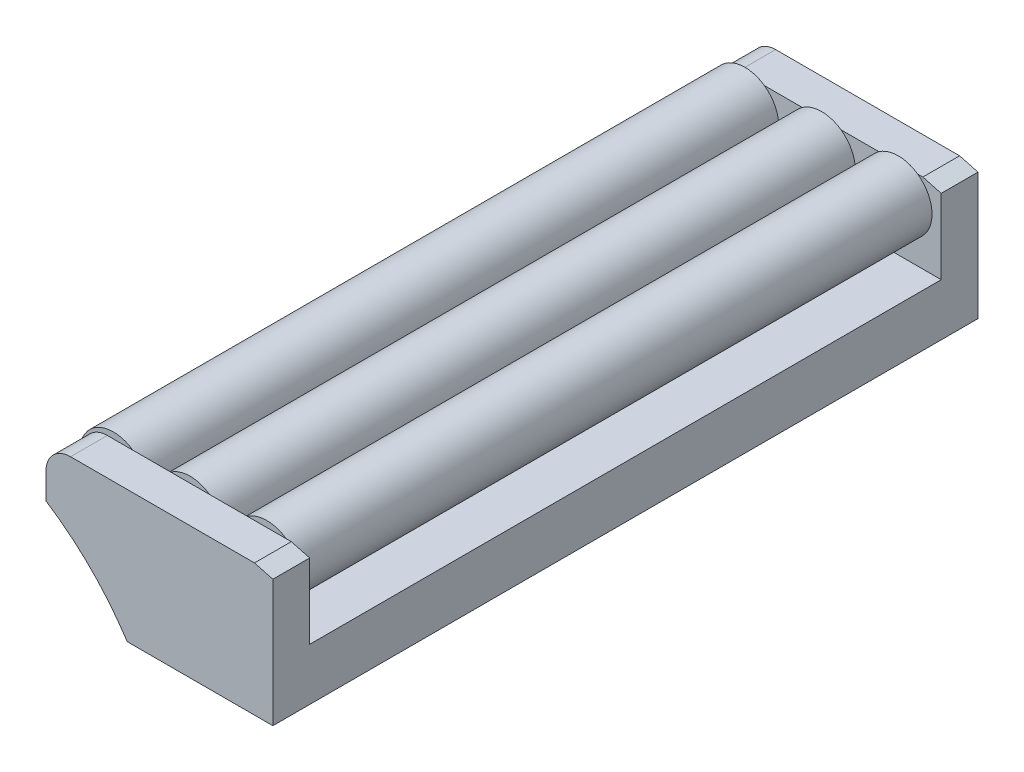
ISO-10303-21;
HEADER;
FILE_DESCRIPTION(('STEP AP214'),'2;1');
FILE_NAME('part.step','',(''),(''),'','','');
FILE_SCHEMA(('AUTOMOTIVE_DESIGN { 1 0 10303 214 1 1 1 1 }'));
ENDSEC;
DATA;
#1=APPLICATION_CONTEXT('core data for automotive mechanical design processes');
#2=APPLICATION_PROTOCOL_DEFINITION('international standard','automotive_design',2000,#1);
#3=PRODUCT_CONTEXT('',#1,'mechanical');
#4=PRODUCT('Part','Part','',(#3));
#5=PRODUCT_RELATED_PRODUCT_CATEGORY('part','',(#4));
#6=PRODUCT_DEFINITION_FORMATION('','',#4);
#7=PRODUCT_DEFINITION_CONTEXT('part definition',#1,'design');
#8=PRODUCT_DEFINITION('design','',#6,#7);
#9=PRODUCT_DEFINITION_SHAPE('','',#8);
#10=(LENGTH_UNIT() NAMED_UNIT(*) SI_UNIT(.MILLI.,.METRE.));
#11=(NAMED_UNIT(*) PLANE_ANGLE_UNIT() SI_UNIT($,.RADIAN.));
#12=(NAMED_UNIT(*) SI_UNIT($,.STERADIAN.) SOLID_ANGLE_UNIT());
#13=UNCERTAINTY_MEASURE_WITH_UNIT(LENGTH_MEASURE(1.E-05),#10,'distance_accuracy_value','');
#14=(GEOMETRIC_REPRESENTATION_CONTEXT(3) GLOBAL_UNCERTAINTY_ASSIGNED_CONTEXT((#13)) GLOBAL_UNIT_ASSIGNED_CONTEXT((#10,
#11,#12)) REPRESENTATION_CONTEXT('',''));
#15=CARTESIAN_POINT('',(0.,0.,0.));
#16=DIRECTION('',(0.,0.,1.));
#17=DIRECTION('',(1.,0.,0.));
#18=AXIS2_PLACEMENT_3D('',#15,#16,#17);
#19=CARTESIAN_POINT('',(0.,0.,115.));
#20=DIRECTION('',(1.,0.,0.));
#21=DIRECTION('',(0.,0.,-1.));
#22=AXIS2_PLACEMENT_3D('',#19,#20,#21);
#23=PLANE('',#22);
#24=DIRECTION('',(0.,-1.00000000000002,0.));
#25=VECTOR('',#24,1.);
#26=CARTESIAN_POINT('',(0.,0.,0.));
#27=LINE('',#26,#25);
#28=CARTESIAN_POINT('',(0.,17.5,0.));
#29=VERTEX_POINT('',#28);
#30=CARTESIAN_POINT('',(0.,13.2458607002147,0.));
#31=VERTEX_POINT('',#30);
#32=EDGE_CURVE('E200',#29,#31,#27,.T.);
#33=ORIENTED_EDGE('',*,*,#32,.T.);
#34=DIRECTION('',(0.,0.,1.));
#35=VECTOR('',#34,1.);
#36=CARTESIAN_POINT('',(0.,13.2458607002147,0.));
#37=LINE('',#36,#35);
#38=CARTESIAN_POINT('',(0.,13.2458607002147,6.00000000000001));
#39=VERTEX_POINT('',#38);
#40=EDGE_CURVE('E176',#31,#39,#37,.T.);
#41=ORIENTED_EDGE('',*,*,#40,.T.);
#42=DIRECTION('',(0.,1.00000000000002,0.));
#43=VECTOR('',#42,1.);
#44=CARTESIAN_POINT('',(0.,0.,6.00000000000001));
#45=LINE('',#44,#43);
#46=CARTESIAN_POINT('',(0.,14.7087121525221,6.00000000000001));
#47=VERTEX_POINT('',#46);
#48=EDGE_CURVE('E297',#39,#47,#45,.T.);
#49=ORIENTED_EDGE('',*,*,#48,.T.);
#50=CARTESIAN_POINT('',(0.,17.5,6.00000000000001));
#51=VERTEX_POINT('',#50);
#52=EDGE_CURVE('E292',#47,#51,#45,.T.);
#53=ORIENTED_EDGE('',*,*,#52,.T.);
#54=DIRECTION('',(0.,0.,-1.));
#55=VECTOR('',#54,1.);
#56=CARTESIAN_POINT('',(0.,17.5,115.));
#57=LINE('',#56,#55);
#58=EDGE_CURVE('E266',#51,#29,#57,.T.);
#59=ORIENTED_EDGE('',*,*,#58,.T.);
#60=EDGE_LOOP('',(#33,#41,#49,#53,#59));
#61=FACE_BOUND('',#60,.T.);
#62=ADVANCED_FACE('F34',(#61),#23,.F.);
#63=CARTESIAN_POINT('',(-46.9999999999999,32.1394616265751,109.));
#64=DIRECTION('',(0.,0.,1.));
#65=DIRECTION('',(1.,0.,0.));
#66=AXIS2_PLACEMENT_3D('',#63,#64,#65);
#67=PLANE('',#66);
#68=DIRECTION('',(1.,0.,0.));
#69=VECTOR('',#68,1.);
#70=CARTESIAN_POINT('',(-47.,8.50000000000006,109.));
#71=LINE('',#70,#69);
#72=CARTESIAN_POINT('',(6.09411708155683,8.50000000000006,109.));
#73=VERTEX_POINT('',#72);
#74=CARTESIAN_POINT('',(37.,8.50000000000006,109.));
#75=VERTEX_POINT('',#74);
#76=EDGE_CURVE('E377',#73,#75,#71,.T.);
#77=ORIENTED_EDGE('',*,*,#76,.F.);
#78=CARTESIAN_POINT('',(-24.5000000000001,-24.4999999999999,109.));
#79=DIRECTION('',(0.,0.,1.));
#80=DIRECTION('',(1.,0.,0.));
#81=AXIS2_PLACEMENT_3D('',#78,#79,#80);
#82=CIRCLE('',#81,45.);
#83=CARTESIAN_POINT('',(0.,13.2458607002147,109.));
#84=VERTEX_POINT('',#83);
#85=EDGE_CURVE('E50',#73,#84,#82,.T.);
#86=ORIENTED_EDGE('',*,*,#85,.T.);
#87=DIRECTION('',(0.,-1.00000000000002,0.));
#88=VECTOR('',#87,1.);
#89=CARTESIAN_POINT('',(0.,0.,109.));
#90=LINE('',#89,#88);
#91=CARTESIAN_POINT('',(0.,14.7087121525221,109.));
#92=VERTEX_POINT('',#91);
#93=EDGE_CURVE('E381',#92,#84,#90,.T.);
#94=ORIENTED_EDGE('',*,*,#93,.F.);
#95=CARTESIAN_POINT('',(5.,17.,109.));
#96=DIRECTION('',(0.,0.,1.));
#97=DIRECTION('',(1.,0.,0.));
#98=AXIS2_PLACEMENT_3D('',#95,#96,#97);
#99=CIRCLE('',#98,5.5);
#100=CARTESIAN_POINT('',(8.1622776601683,21.5,109.));
#101=VERTEX_POINT('',#100);
#102=EDGE_CURVE('E363',#92,#101,#99,.T.);
#103=ORIENTED_EDGE('',*,*,#102,.T.);
#104=DIRECTION('',(-1.,0.,0.));
#105=VECTOR('',#104,1.);
#106=CARTESIAN_POINT('',(0.,21.5,109.));
#107=LINE('',#106,#105);
#108=CARTESIAN_POINT('',(14.3377223398315,21.5,109.));
#109=VERTEX_POINT('',#108);
#110=EDGE_CURVE('E403',#109,#101,#107,.T.);
#111=ORIENTED_EDGE('',*,*,#110,.F.);
#112=CARTESIAN_POINT('',(17.5,17.,109.));
#113=DIRECTION('',(0.,0.,1.));
#114=DIRECTION('',(1.,0.,0.));
#115=AXIS2_PLACEMENT_3D('',#112,#113,#114);
#116=CIRCLE('',#115,5.5);
#117=CARTESIAN_POINT('',(20.6622776601684,21.5000000000044,109.));
#118=VERTEX_POINT('',#117);
#119=EDGE_CURVE('E356',#109,#118,#116,.T.);
#120=ORIENTED_EDGE('',*,*,#119,.T.);
#121=CARTESIAN_POINT('',(26.8377223398316,21.5000000000044,109.));
#122=VERTEX_POINT('',#121);
#123=EDGE_CURVE('E242',#122,#118,#107,.T.);
#124=ORIENTED_EDGE('',*,*,#123,.F.);
#125=CARTESIAN_POINT('',(30.,17.0000000000045,109.));
#126=DIRECTION('',(0.,0.,1.));
#127=DIRECTION('',(1.,0.,0.));
#128=AXIS2_PLACEMENT_3D('',#125,#126,#127);
#129=CIRCLE('',#128,5.49999999999999);
#130=CARTESIAN_POINT('',(33.1622776601683,21.5,109.));
#131=VERTEX_POINT('',#130);
#132=EDGE_CURVE('E339',#122,#131,#129,.T.);
#133=ORIENTED_EDGE('',*,*,#132,.T.);
#134=CARTESIAN_POINT('',(33.9999999999998,21.5,109.));
#135=VERTEX_POINT('',#134);
#136=EDGE_CURVE('E238',#135,#131,#107,.T.);
#137=ORIENTED_EDGE('',*,*,#136,.F.);
#138=DIRECTION('',(-0.965925826289069,0.258819045102515,0.));
#139=VECTOR('',#138,1.);
#140=CARTESIAN_POINT('',(33.9999999999998,21.5,109.));
#141=LINE('',#140,#139);
#142=CARTESIAN_POINT('',(37.,20.6961524227066,109.));
#143=VERTEX_POINT('',#142);
#144=EDGE_CURVE('E262',#135,#143,#141,.F.);
#145=ORIENTED_EDGE('',*,*,#144,.T.);
#146=DIRECTION('',(0.,-1.00000000000002,0.));
#147=VECTOR('',#146,1.);
#148=CARTESIAN_POINT('',(37.,32.139461626575,109.));
#149=LINE('',#148,#147);
#150=EDGE_CURVE('E367',#143,#75,#149,.T.);
#151=ORIENTED_EDGE('',*,*,#150,.T.);
#152=EDGE_LOOP('',(#77,#86,#94,#103,#111,#120,#124,#133,#137,#145,#151));
#153=FACE_BOUND('',#152,.T.);
#154=ADVANCED_FACE('F335',(#153),#67,.F.);
#155=CARTESIAN_POINT('',(-46.9999999999999,32.1394616265751,6.00000000000001));
#156=DIRECTION('',(0.,0.,-1.));
#157=DIRECTION('',(0.,1.00000000000002,0.));
#158=AXIS2_PLACEMENT_3D('',#155,#156,#157);
#159=PLANE('',#158);
#160=ORIENTED_EDGE('',*,*,#48,.F.);
#161=CARTESIAN_POINT('',(-24.5000000000001,-24.4999999999999,6.00000000000001));
#162=DIRECTION('',(0.,0.,-1.));
#163=DIRECTION('',(0.,1.00000000000002,0.));
#164=AXIS2_PLACEMENT_3D('',#161,#162,#163);
#165=CIRCLE('',#164,45.);
#166=CARTESIAN_POINT('',(6.09411708155683,8.50000000000006,6.00000000000001));
#167=VERTEX_POINT('',#166);
#168=EDGE_CURVE('E182',#39,#167,#165,.T.);
#169=ORIENTED_EDGE('',*,*,#168,.T.);
#170=DIRECTION('',(1.,0.,0.));
#171=VECTOR('',#170,1.);
#172=CARTESIAN_POINT('',(-47.,8.50000000000006,6.00000000000001));
#173=LINE('',#172,#171);
#174=CARTESIAN_POINT('',(37.,8.50000000000006,6.00000000000001));
#175=VERTEX_POINT('',#174);
#176=EDGE_CURVE('E299',#167,#175,#173,.T.);
#177=ORIENTED_EDGE('',*,*,#176,.T.);
#178=DIRECTION('',(0.,1.00000000000002,0.));
#179=VECTOR('',#178,1.);
#180=CARTESIAN_POINT('',(37.,32.139461626575,6.00000000000001));
#181=LINE('',#180,#179);
#182=CARTESIAN_POINT('',(37.,20.6961524227066,6.00000000000001));
#183=VERTEX_POINT('',#182);
#184=EDGE_CURVE('E374',#175,#183,#181,.T.);
#185=ORIENTED_EDGE('',*,*,#184,.T.);
#186=DIRECTION('',(0.965925826289069,-0.258819045102515,0.));
#187=VECTOR('',#186,1.);
#188=CARTESIAN_POINT('',(33.9999999999998,21.5,6.00000000000001));
#189=LINE('',#188,#187);
#190=CARTESIAN_POINT('',(33.9999999999998,21.5,6.00000000000001));
#191=VERTEX_POINT('',#190);
#192=EDGE_CURVE('E256',#183,#191,#189,.F.);
#193=ORIENTED_EDGE('',*,*,#192,.T.);
#194=DIRECTION('',(1.,0.,0.));
#195=VECTOR('',#194,1.);
#196=CARTESIAN_POINT('',(0.,21.5,6.00000000000001));
#197=LINE('',#196,#195);
#198=CARTESIAN_POINT('',(33.1622776601683,21.5,6.00000000000001));
#199=VERTEX_POINT('',#198);
#200=EDGE_CURVE('E232',#199,#191,#197,.T.);
#201=ORIENTED_EDGE('',*,*,#200,.F.);
#202=CARTESIAN_POINT('',(30.,17.0000000000045,6.00000000000001));
#203=DIRECTION('',(0.,0.,1.));
#204=DIRECTION('',(1.,0.,0.));
#205=AXIS2_PLACEMENT_3D('',#202,#203,#204);
#206=CIRCLE('',#205,5.49999999999999);
#207=CARTESIAN_POINT('',(26.8377223398316,21.5000000000044,6.00000000000001));
#208=VERTEX_POINT('',#207);
#209=EDGE_CURVE('E193',#208,#199,#206,.T.);
#210=ORIENTED_EDGE('',*,*,#209,.F.);
#211=CARTESIAN_POINT('',(20.6622776601684,21.5000000000044,6.00000000000001));
#212=VERTEX_POINT('',#211);
#213=EDGE_CURVE('E715',#212,#208,#197,.T.);
#214=ORIENTED_EDGE('',*,*,#213,.F.);
#215=CARTESIAN_POINT('',(17.5,17.,6.00000000000001));
#216=DIRECTION('',(0.,0.,1.));
#217=DIRECTION('',(1.,0.,0.));
#218=AXIS2_PLACEMENT_3D('',#215,#216,#217);
#219=CIRCLE('',#218,5.5);
#220=CARTESIAN_POINT('',(14.3377223398315,21.5,6.00000000000001));
#221=VERTEX_POINT('',#220);
#222=EDGE_CURVE('E349',#221,#212,#219,.T.);
#223=ORIENTED_EDGE('',*,*,#222,.F.);
#224=CARTESIAN_POINT('',(8.1622776601683,21.5,6.00000000000001));
#225=VERTEX_POINT('',#224);
#226=EDGE_CURVE('E237',#225,#221,#197,.T.);
#227=ORIENTED_EDGE('',*,*,#226,.F.);
#228=CARTESIAN_POINT('',(5.,17.,6.00000000000001));
#229=DIRECTION('',(0.,0.,-1.));
#230=DIRECTION('',(0.,1.00000000000002,0.));
#231=AXIS2_PLACEMENT_3D('',#228,#229,#230);
#232=CIRCLE('',#231,5.5);
#233=EDGE_CURVE('E240',#47,#225,#232,.F.);
#234=ORIENTED_EDGE('',*,*,#233,.F.);
#235=EDGE_LOOP('',(#160,#169,#177,#185,#193,#201,#210,#214,#223,#227,#234));
#236=FACE_BOUND('',#235,.T.);
#237=ADVANCED_FACE('F433',(#236),#159,.F.);
#238=CARTESIAN_POINT('',(0.,21.5,115.));
#239=DIRECTION('',(0.,-1.00000000000002,0.));
#240=DIRECTION('',(0.,0.,-1.));
#241=AXIS2_PLACEMENT_3D('',#238,#239,#240);
#242=PLANE('',#241);
#243=CARTESIAN_POINT('',(4.,21.5,109.));
#244=VERTEX_POINT('',#243);
#245=EDGE_CURVE('E236',#101,#244,#107,.T.);
#246=ORIENTED_EDGE('',*,*,#245,.T.);
#247=DIRECTION('',(0.,0.,-1.));
#248=VECTOR('',#247,1.);
#249=CARTESIAN_POINT('',(4.,21.5,115.));
#250=LINE('',#249,#248);
#251=CARTESIAN_POINT('',(4.,21.5,115.));
#252=VERTEX_POINT('',#251);
#253=EDGE_CURVE('E272',#244,#252,#250,.F.);
#254=ORIENTED_EDGE('',*,*,#253,.T.);
#255=DIRECTION('',(-1.,0.,0.));
#256=VECTOR('',#255,1.);
#257=CARTESIAN_POINT('',(0.,21.5,115.));
#258=LINE('',#257,#256);
#259=CARTESIAN_POINT('',(33.9999999999998,21.5,115.));
#260=VERTEX_POINT('',#259);
#261=EDGE_CURVE('E225',#260,#252,#258,.T.);
#262=ORIENTED_EDGE('',*,*,#261,.F.);
#263=DIRECTION('',(0.,0.,-1.));
#264=VECTOR('',#263,1.);
#265=CARTESIAN_POINT('',(33.9999999999998,21.5,115.));
#266=LINE('',#265,#264);
#267=EDGE_CURVE('E259',#260,#135,#266,.T.);
#268=ORIENTED_EDGE('',*,*,#267,.T.);
#269=ORIENTED_EDGE('',*,*,#136,.T.);
#270=EDGE_CURVE('E241',#131,#122,#107,.T.);
#271=ORIENTED_EDGE('',*,*,#270,.T.);
#272=ORIENTED_EDGE('',*,*,#123,.T.);
#273=EDGE_CURVE('E404',#118,#109,#107,.T.);
#274=ORIENTED_EDGE('',*,*,#273,.T.);
#275=ORIENTED_EDGE('',*,*,#110,.T.);
#276=EDGE_LOOP('',(#246,#254,#262,#268,#269,#271,#272,#274,#275));
#277=FACE_BOUND('',#276,.T.);
#278=ADVANCED_FACE('F329',(#277),#242,.F.);
#279=ORIENTED_EDGE('',*,*,#93,.T.);
#280=CARTESIAN_POINT('',(0.,13.2458607002147,115.));
#281=VERTEX_POINT('',#280);
#282=EDGE_CURVE('E392',#84,#281,#37,.T.);
#283=ORIENTED_EDGE('',*,*,#282,.T.);
#284=DIRECTION('',(0.,-1.00000000000002,0.));
#285=VECTOR('',#284,1.);
#286=CARTESIAN_POINT('',(0.,0.,115.));
#287=LINE('',#286,#285);
#288=CARTESIAN_POINT('',(0.,17.5,115.));
#289=VERTEX_POINT('',#288);
#290=EDGE_CURVE('E215',#289,#281,#287,.T.);
#291=ORIENTED_EDGE('',*,*,#290,.F.);
#292=DIRECTION('',(0.,0.,-1.));
#293=VECTOR('',#292,1.);
#294=CARTESIAN_POINT('',(0.,17.5,115.));
#295=LINE('',#294,#293);
#296=CARTESIAN_POINT('',(0.,17.5,109.));
#297=VERTEX_POINT('',#296);
#298=EDGE_CURVE('E269',#289,#297,#295,.T.);
#299=ORIENTED_EDGE('',*,*,#298,.T.);
#300=EDGE_CURVE('E209',#297,#92,#90,.T.);
#301=ORIENTED_EDGE('',*,*,#300,.T.);
#302=EDGE_LOOP('',(#279,#283,#291,#299,#301));
#303=FACE_BOUND('',#302,.T.);
#304=ADVANCED_FACE('F36',(#303),#23,.F.);
#305=CARTESIAN_POINT('',(0.,0.,115.));
#306=DIRECTION('',(0.,1.00000000000002,0.));
#307=DIRECTION('',(0.,0.,1.));
#308=AXIS2_PLACEMENT_3D('',#305,#306,#307);
#309=PLANE('',#308);
#310=CARTESIAN_POINT('',(23.,4.44089209850063E-12,9.50000000000001));
#311=DIRECTION('',(0.,-1.00000000000002,0.));
#312=DIRECTION('',(0.,0.,-1.));
#313=AXIS2_PLACEMENT_3D('',#310,#311,#312);
#314=CIRCLE('',#313,3.);
#315=CARTESIAN_POINT('',(23.,4.44089209850063E-12,6.5));
#316=VERTEX_POINT('',#315);
#317=EDGE_CURVE('E471',#316,#316,#314,.T.);
#318=ORIENTED_EDGE('',*,*,#317,.F.);
#319=EDGE_LOOP('',(#318));
#320=FACE_BOUND('',#319,.T.);
#321=CARTESIAN_POINT('',(23.,4.44089209850063E-12,105.5));
#322=DIRECTION('',(0.,-1.00000000000002,0.));
#323=DIRECTION('',(0.,0.,-1.));
#324=AXIS2_PLACEMENT_3D('',#321,#322,#323);
#325=CIRCLE('',#324,3.);
#326=CARTESIAN_POINT('',(23.,4.44089209850063E-12,102.5));
#327=VERTEX_POINT('',#326);
#328=EDGE_CURVE('E470',#327,#327,#325,.T.);
#329=ORIENTED_EDGE('',*,*,#328,.F.);
#330=EDGE_LOOP('',(#329));
#331=FACE_BOUND('',#330,.T.);
#332=DIRECTION('',(1.,0.,0.));
#333=VECTOR('',#332,1.);
#334=CARTESIAN_POINT('',(0.,0.,115.));
#335=LINE('',#334,#333);
#336=CARTESIAN_POINT('',(13.2458607002146,0.,115.));
#337=VERTEX_POINT('',#336);
#338=CARTESIAN_POINT('',(36.9999999999999,0.,115.));
#339=VERTEX_POINT('',#338);
#340=EDGE_CURVE('E191',#337,#339,#335,.T.);
#341=ORIENTED_EDGE('',*,*,#340,.F.);
#342=DIRECTION('',(0.,0.,1.));
#343=VECTOR('',#342,1.);
#344=CARTESIAN_POINT('',(13.2458607002146,0.,0.));
#345=LINE('',#344,#343);
#346=CARTESIAN_POINT('',(13.2458607002146,0.,0.));
#347=VERTEX_POINT('',#346);
#348=EDGE_CURVE('E173',#337,#347,#345,.F.);
#349=ORIENTED_EDGE('',*,*,#348,.T.);
#350=DIRECTION('',(1.,0.,0.));
#351=VECTOR('',#350,1.);
#352=CARTESIAN_POINT('',(0.,0.,0.));
#353=LINE('',#352,#351);
#354=CARTESIAN_POINT('',(36.9999999999999,0.,0.));
#355=VERTEX_POINT('',#354);
#356=EDGE_CURVE('E189',#347,#355,#353,.T.);
#357=ORIENTED_EDGE('',*,*,#356,.T.);
#358=DIRECTION('',(0.,0.,-1.));
#359=VECTOR('',#358,1.);
#360=CARTESIAN_POINT('',(36.9999999999999,0.,115.));
#361=LINE('',#360,#359);
#362=EDGE_CURVE('E229',#339,#355,#361,.T.);
#363=ORIENTED_EDGE('',*,*,#362,.F.);
#364=EDGE_LOOP('',(#341,#349,#357,#363));
#365=FACE_BOUND('',#364,.T.);
#366=ADVANCED_FACE('F187',(#320,#331,#365),#309,.F.);
#367=CARTESIAN_POINT('',(36.9999999999999,0.,115.));
#368=DIRECTION('',(-1.,0.,0.));
#369=DIRECTION('',(0.,0.,1.));
#370=AXIS2_PLACEMENT_3D('',#367,#368,#369);
#371=PLANE('',#370);
#372=DIRECTION('',(0.,1.00000000000002,0.));
#373=VECTOR('',#372,1.);
#374=CARTESIAN_POINT('',(36.9999999999999,0.,0.));
#375=LINE('',#374,#373);
#376=CARTESIAN_POINT('',(36.9999999999999,20.6961524227066,0.));
#377=VERTEX_POINT('',#376);
#378=EDGE_CURVE('E198',#355,#377,#375,.T.);
#379=ORIENTED_EDGE('',*,*,#378,.T.);
#380=DIRECTION('',(0.,0.,1.));
#381=VECTOR('',#380,1.);
#382=CARTESIAN_POINT('',(36.9999999999999,20.6961524227066,115.));
#383=LINE('',#382,#381);
#384=EDGE_CURVE('E254',#377,#183,#383,.T.);
#385=ORIENTED_EDGE('',*,*,#384,.T.);
#386=ORIENTED_EDGE('',*,*,#184,.F.);
#387=DIRECTION('',(0.,0.,-1.));
#388=VECTOR('',#387,1.);
#389=CARTESIAN_POINT('',(37.,8.50000000000006,109.));
#390=LINE('',#389,#388);
#391=EDGE_CURVE('E370',#75,#175,#390,.T.);
#392=ORIENTED_EDGE('',*,*,#391,.F.);
#393=ORIENTED_EDGE('',*,*,#150,.F.);
#394=DIRECTION('',(0.,0.,1.));
#395=VECTOR('',#394,1.);
#396=CARTESIAN_POINT('',(36.9999999999999,20.6961524227066,115.));
#397=LINE('',#396,#395);
#398=CARTESIAN_POINT('',(36.9999999999999,20.6961524227066,115.));
#399=VERTEX_POINT('',#398);
#400=EDGE_CURVE('E252',#143,#399,#397,.T.);
#401=ORIENTED_EDGE('',*,*,#400,.T.);
#402=DIRECTION('',(0.,1.00000000000002,0.));
#403=VECTOR('',#402,1.);
#404=CARTESIAN_POINT('',(36.9999999999999,0.,115.));
#405=LINE('',#404,#403);
#406=EDGE_CURVE('E221',#339,#399,#405,.T.);
#407=ORIENTED_EDGE('',*,*,#406,.F.);
#408=ORIENTED_EDGE('',*,*,#362,.T.);
#409=EDGE_LOOP('',(#379,#385,#386,#392,#393,#401,#407,#408));
#410=FACE_BOUND('',#409,.T.);
#411=ADVANCED_FACE('F313',(#410),#371,.F.);
#412=DIRECTION('',(-1.,0.,0.));
#413=VECTOR('',#412,1.);
#414=CARTESIAN_POINT('',(0.,21.5,0.));
#415=LINE('',#414,#413);
#416=CARTESIAN_POINT('',(33.9999999999998,21.5,0.));
#417=VERTEX_POINT('',#416);
#418=CARTESIAN_POINT('',(4.,21.5,0.));
#419=VERTEX_POINT('',#418);
#420=EDGE_CURVE('E206',#417,#419,#415,.T.);
#421=ORIENTED_EDGE('',*,*,#420,.T.);
#422=DIRECTION('',(0.,0.,-1.));
#423=VECTOR('',#422,1.);
#424=CARTESIAN_POINT('',(4.,21.5,115.));
#425=LINE('',#424,#423);
#426=CARTESIAN_POINT('',(4.,21.5,6.00000000000001));
#427=VERTEX_POINT('',#426);
#428=EDGE_CURVE('E57',#419,#427,#425,.F.);
#429=ORIENTED_EDGE('',*,*,#428,.T.);
#430=EDGE_CURVE('E233',#427,#225,#197,.T.);
#431=ORIENTED_EDGE('',*,*,#430,.T.);
#432=ORIENTED_EDGE('',*,*,#226,.T.);
#433=EDGE_CURVE('E711',#221,#212,#197,.T.);
#434=ORIENTED_EDGE('',*,*,#433,.T.);
#435=ORIENTED_EDGE('',*,*,#213,.T.);
#436=EDGE_CURVE('E733',#208,#199,#197,.T.);
#437=ORIENTED_EDGE('',*,*,#436,.T.);
#438=ORIENTED_EDGE('',*,*,#200,.T.);
#439=DIRECTION('',(0.,0.,-1.));
#440=VECTOR('',#439,1.);
#441=CARTESIAN_POINT('',(33.9999999999998,21.5,115.));
#442=LINE('',#441,#440);
#443=EDGE_CURVE('E246',#191,#417,#442,.T.);
#444=ORIENTED_EDGE('',*,*,#443,.T.);
#445=EDGE_LOOP('',(#421,#429,#431,#432,#434,#435,#437,#438,#444));
#446=FACE_BOUND('',#445,.T.);
#447=ADVANCED_FACE('F303',(#446),#242,.F.);
#448=CARTESIAN_POINT('',(0.,21.5,115.));
#449=DIRECTION('',(0.,0.,-1.));
#450=DIRECTION('',(-1.,0.,0.));
#451=AXIS2_PLACEMENT_3D('',#448,#449,#450);
#452=PLANE('',#451);
#453=ORIENTED_EDGE('',*,*,#290,.T.);
#454=CARTESIAN_POINT('',(-24.5000000000001,-24.4999999999999,115.));
#455=DIRECTION('',(0.,0.,1.));
#456=DIRECTION('',(1.,0.,0.));
#457=AXIS2_PLACEMENT_3D('',#454,#455,#456);
#458=CIRCLE('',#457,45.);
#459=EDGE_CURVE('E183',#337,#281,#458,.T.);
#460=ORIENTED_EDGE('',*,*,#459,.F.);
#461=ORIENTED_EDGE('',*,*,#340,.T.);
#462=ORIENTED_EDGE('',*,*,#406,.T.);
#463=DIRECTION('',(0.965925826289069,-0.258819045102515,0.));
#464=VECTOR('',#463,1.);
#465=CARTESIAN_POINT('',(33.9999999999998,21.5,115.));
#466=LINE('',#465,#464);
#467=EDGE_CURVE('E264',#399,#260,#466,.F.);
#468=ORIENTED_EDGE('',*,*,#467,.T.);
#469=ORIENTED_EDGE('',*,*,#261,.T.);
#470=CARTESIAN_POINT('',(4.,17.5,115.));
#471=DIRECTION('',(0.,0.,-1.));
#472=DIRECTION('',(-1.,0.,0.));
#473=AXIS2_PLACEMENT_3D('',#470,#471,#472);
#474=CIRCLE('',#473,4.);
#475=EDGE_CURVE('E275',#252,#289,#474,.F.);
#476=ORIENTED_EDGE('',*,*,#475,.T.);
#477=EDGE_LOOP('',(#453,#460,#461,#462,#468,#469,#476));
#478=FACE_BOUND('',#477,.T.);
#479=ADVANCED_FACE('F321',(#478),#452,.F.);
#480=CARTESIAN_POINT('',(0.,21.5,0.));
#481=DIRECTION('',(0.,0.,-1.));
#482=DIRECTION('',(-1.,0.,0.));
#483=AXIS2_PLACEMENT_3D('',#480,#481,#482);
#484=PLANE('',#483);
#485=CARTESIAN_POINT('',(-24.5000000000001,-24.4999999999999,0.));
#486=DIRECTION('',(0.,0.,1.));
#487=DIRECTION('',(1.,0.,0.));
#488=AXIS2_PLACEMENT_3D('',#485,#486,#487);
#489=CIRCLE('',#488,45.);
#490=EDGE_CURVE('E170',#347,#31,#489,.T.);
#491=ORIENTED_EDGE('',*,*,#490,.T.);
#492=ORIENTED_EDGE('',*,*,#32,.F.);
#493=CARTESIAN_POINT('',(4.,17.5,0.));
#494=DIRECTION('',(0.,0.,-1.));
#495=DIRECTION('',(-1.,0.,0.));
#496=AXIS2_PLACEMENT_3D('',#493,#494,#495);
#497=CIRCLE('',#496,4.);
#498=EDGE_CURVE('E277',#29,#419,#497,.T.);
#499=ORIENTED_EDGE('',*,*,#498,.T.);
#500=ORIENTED_EDGE('',*,*,#420,.F.);
#501=DIRECTION('',(-0.965925826289069,0.258819045102515,0.));
#502=VECTOR('',#501,1.);
#503=CARTESIAN_POINT('',(2.27756813566449,29.9999999999999,0.));
#504=LINE('',#503,#502);
#505=EDGE_CURVE('E250',#417,#377,#504,.F.);
#506=ORIENTED_EDGE('',*,*,#505,.T.);
#507=ORIENTED_EDGE('',*,*,#378,.F.);
#508=ORIENTED_EDGE('',*,*,#356,.F.);
#509=EDGE_LOOP('',(#491,#492,#499,#500,#506,#507,#508));
#510=FACE_BOUND('',#509,.T.);
#511=ADVANCED_FACE('F196',(#510),#484,.T.);
#512=CARTESIAN_POINT('',(-47.,8.50000000000006,109.));
#513=DIRECTION('',(0.,-1.00000000000002,0.));
#514=DIRECTION('',(1.,0.,0.));
#515=AXIS2_PLACEMENT_3D('',#512,#513,#514);
#516=PLANE('',#515);
#517=CARTESIAN_POINT('',(23.,8.5000000000045,9.50000000000001));
#518=DIRECTION('',(0.,-1.00000000000002,0.));
#519=DIRECTION('',(1.,0.,0.));
#520=AXIS2_PLACEMENT_3D('',#517,#518,#519);
#521=CIRCLE('',#520,3.);
#522=CARTESIAN_POINT('',(26.,8.50000000000452,9.50000000000001));
#523=VERTEX_POINT('',#522);
#524=EDGE_CURVE('E467',#523,#523,#521,.F.);
#525=ORIENTED_EDGE('',*,*,#524,.F.);
#526=EDGE_LOOP('',(#525));
#527=FACE_BOUND('',#526,.T.);
#528=CARTESIAN_POINT('',(23.,8.5000000000045,105.5));
#529=DIRECTION('',(0.,-1.00000000000002,0.));
#530=DIRECTION('',(1.,0.,0.));
#531=AXIS2_PLACEMENT_3D('',#528,#529,#530);
#532=CIRCLE('',#531,3.);
#533=CARTESIAN_POINT('',(26.,8.50000000000452,105.5));
#534=VERTEX_POINT('',#533);
#535=EDGE_CURVE('E477',#534,#534,#532,.F.);
#536=ORIENTED_EDGE('',*,*,#535,.F.);
#537=EDGE_LOOP('',(#536));
#538=FACE_BOUND('',#537,.T.);
#539=ORIENTED_EDGE('',*,*,#176,.F.);
#540=DIRECTION('',(0.,0.,1.));
#541=VECTOR('',#540,1.);
#542=CARTESIAN_POINT('',(6.09411708155683,8.50000000000006,0.));
#543=LINE('',#542,#541);
#544=EDGE_CURVE('E11',#167,#73,#543,.T.);
#545=ORIENTED_EDGE('',*,*,#544,.T.);
#546=ORIENTED_EDGE('',*,*,#76,.T.);
#547=ORIENTED_EDGE('',*,*,#391,.T.);
#548=EDGE_LOOP('',(#539,#545,#546,#547));
#549=FACE_BOUND('',#548,.T.);
#550=ADVANCED_FACE('F508',(#527,#538,#549),#516,.F.);
#551=CARTESIAN_POINT('',(-46.9999999999999,32.1394616265751,109.));
#552=DIRECTION('',(0.,0.,1.));
#553=DIRECTION('',(1.,0.,0.));
#554=AXIS2_PLACEMENT_3D('',#551,#552,#553);
#555=PLANE('',#554);
#556=ORIENTED_EDGE('',*,*,#300,.F.);
#557=CARTESIAN_POINT('',(4.,17.5,109.));
#558=DIRECTION('',(0.,0.,1.));
#559=DIRECTION('',(1.,0.,0.));
#560=AXIS2_PLACEMENT_3D('',#557,#558,#559);
#561=CIRCLE('',#560,4.);
#562=EDGE_CURVE('E281',#297,#244,#561,.F.);
#563=ORIENTED_EDGE('',*,*,#562,.T.);
#564=ORIENTED_EDGE('',*,*,#245,.F.);
#565=EDGE_CURVE('E364',#101,#92,#99,.T.);
#566=ORIENTED_EDGE('',*,*,#565,.T.);
#567=EDGE_LOOP('',(#556,#563,#564,#566));
#568=FACE_BOUND('',#567,.T.);
#569=ADVANCED_FACE('F401',(#568),#555,.T.);
#570=CARTESIAN_POINT('',(5.,17.,6.00000000000001));
#571=DIRECTION('',(0.,0.,1.));
#572=DIRECTION('',(1.,0.,0.));
#573=AXIS2_PLACEMENT_3D('',#570,#571,#572);
#574=PLANE('',#573);
#575=CARTESIAN_POINT('',(5.,17.,6.00000000000001));
#576=DIRECTION('',(0.,0.,1.));
#577=DIRECTION('',(1.,0.,0.));
#578=AXIS2_PLACEMENT_3D('',#575,#576,#577);
#579=CIRCLE('',#578,5.5);
#580=EDGE_CURVE('E360',#225,#47,#579,.T.);
#581=ORIENTED_EDGE('',*,*,#580,.F.);
#582=ORIENTED_EDGE('',*,*,#430,.F.);
#583=CARTESIAN_POINT('',(4.,17.5,6.00000000000001));
#584=DIRECTION('',(0.,0.,1.));
#585=DIRECTION('',(1.,0.,0.));
#586=AXIS2_PLACEMENT_3D('',#583,#584,#585);
#587=CIRCLE('',#586,4.);
#588=EDGE_CURVE('E43',#427,#51,#587,.T.);
#589=ORIENTED_EDGE('',*,*,#588,.T.);
#590=ORIENTED_EDGE('',*,*,#52,.F.);
#591=EDGE_LOOP('',(#581,#582,#589,#590));
#592=FACE_BOUND('',#591,.T.);
#593=ADVANCED_FACE('F291',(#592),#574,.F.);
#594=CARTESIAN_POINT('',(5.,17.,124.556349186104));
#595=DIRECTION('',(0.,0.,-1.));
#596=DIRECTION('',(-1.,0.,0.));
#597=AXIS2_PLACEMENT_3D('',#594,#595,#596);
#598=CYLINDRICAL_SURFACE('',#597,5.5);
#599=ORIENTED_EDGE('',*,*,#580,.T.);
#600=ORIENTED_EDGE('',*,*,#233,.T.);
#601=EDGE_LOOP('',(#599,#600));
#602=FACE_BOUND('',#601,.T.);
#603=ORIENTED_EDGE('',*,*,#565,.F.);
#604=ORIENTED_EDGE('',*,*,#102,.F.);
#605=EDGE_LOOP('',(#603,#604));
#606=FACE_BOUND('',#605,.T.);
#607=ADVANCED_FACE('F399',(#602,#606),#598,.T.);
#608=CARTESIAN_POINT('',(-46.9999999999999,32.1394616265751,109.));
#609=DIRECTION('',(0.,0.,1.));
#610=DIRECTION('',(1.,0.,0.));
#611=AXIS2_PLACEMENT_3D('',#608,#609,#610);
#612=PLANE('',#611);
#613=ORIENTED_EDGE('',*,*,#273,.F.);
#614=EDGE_CURVE('E357',#118,#109,#116,.T.);
#615=ORIENTED_EDGE('',*,*,#614,.T.);
#616=EDGE_LOOP('',(#613,#615));
#617=FACE_BOUND('',#616,.T.);
#618=ADVANCED_FACE('F497',(#617),#612,.T.);
#619=CARTESIAN_POINT('',(17.5,17.,6.00000000000001));
#620=DIRECTION('',(0.,0.,1.));
#621=DIRECTION('',(1.,0.,0.));
#622=AXIS2_PLACEMENT_3D('',#619,#620,#621);
#623=PLANE('',#622);
#624=EDGE_CURVE('E353',#212,#221,#219,.T.);
#625=ORIENTED_EDGE('',*,*,#624,.F.);
#626=ORIENTED_EDGE('',*,*,#433,.F.);
#627=EDGE_LOOP('',(#625,#626));
#628=FACE_BOUND('',#627,.T.);
#629=ADVANCED_FACE('F502',(#628),#623,.F.);
#630=CARTESIAN_POINT('',(17.5,17.,124.556349186104));
#631=DIRECTION('',(0.,0.,-1.));
#632=DIRECTION('',(-1.,0.,0.));
#633=AXIS2_PLACEMENT_3D('',#630,#631,#632);
#634=CYLINDRICAL_SURFACE('',#633,5.5);
#635=ORIENTED_EDGE('',*,*,#624,.T.);
#636=ORIENTED_EDGE('',*,*,#222,.T.);
#637=EDGE_LOOP('',(#635,#636));
#638=FACE_BOUND('',#637,.T.);
#639=ORIENTED_EDGE('',*,*,#614,.F.);
#640=ORIENTED_EDGE('',*,*,#119,.F.);
#641=EDGE_LOOP('',(#639,#640));
#642=FACE_BOUND('',#641,.T.);
#643=ADVANCED_FACE('F550',(#638,#642),#634,.T.);
#644=CARTESIAN_POINT('',(-46.9999999999999,32.1394616265751,109.));
#645=DIRECTION('',(0.,0.,1.));
#646=DIRECTION('',(1.,0.,0.));
#647=AXIS2_PLACEMENT_3D('',#644,#645,#646);
#648=PLANE('',#647);
#649=ORIENTED_EDGE('',*,*,#270,.F.);
#650=EDGE_CURVE('E344',#131,#122,#129,.T.);
#651=ORIENTED_EDGE('',*,*,#650,.T.);
#652=EDGE_LOOP('',(#649,#651));
#653=FACE_BOUND('',#652,.T.);
#654=ADVANCED_FACE('F415',(#653),#648,.T.);
#655=CARTESIAN_POINT('',(30.,17.0000000000045,6.00000000000001));
#656=DIRECTION('',(0.,0.,1.));
#657=DIRECTION('',(1.,0.,0.));
#658=AXIS2_PLACEMENT_3D('',#655,#656,#657);
#659=PLANE('',#658);
#660=EDGE_CURVE('E345',#199,#208,#206,.T.);
#661=ORIENTED_EDGE('',*,*,#660,.F.);
#662=ORIENTED_EDGE('',*,*,#436,.F.);
#663=EDGE_LOOP('',(#661,#662));
#664=FACE_BOUND('',#663,.T.);
#665=ADVANCED_FACE('F418',(#664),#659,.F.);
#666=CARTESIAN_POINT('',(30.,17.0000000000045,124.556349186104));
#667=DIRECTION('',(0.,0.,-1.));
#668=DIRECTION('',(-1.,0.,0.));
#669=AXIS2_PLACEMENT_3D('',#666,#667,#668);
#670=CYLINDRICAL_SURFACE('',#669,5.49999999999999);
#671=ORIENTED_EDGE('',*,*,#660,.T.);
#672=ORIENTED_EDGE('',*,*,#209,.T.);
#673=EDGE_LOOP('',(#671,#672));
#674=FACE_BOUND('',#673,.T.);
#675=ORIENTED_EDGE('',*,*,#650,.F.);
#676=ORIENTED_EDGE('',*,*,#132,.F.);
#677=EDGE_LOOP('',(#675,#676));
#678=FACE_BOUND('',#677,.T.);
#679=ADVANCED_FACE('F416',(#674,#678),#670,.T.);
#680=CARTESIAN_POINT('',(33.9999999999998,21.5,115.));
#681=DIRECTION('',(-0.258819045102524,-0.965925826289087,0.));
#682=DIRECTION('',(0.965925826289069,-0.258819045102515,0.));
#683=AXIS2_PLACEMENT_3D('',#680,#681,#682);
#684=PLANE('',#683);
#685=ORIENTED_EDGE('',*,*,#192,.F.);
#686=ORIENTED_EDGE('',*,*,#384,.F.);
#687=ORIENTED_EDGE('',*,*,#505,.F.);
#688=ORIENTED_EDGE('',*,*,#443,.F.);
#689=EDGE_LOOP('',(#685,#686,#687,#688));
#690=FACE_BOUND('',#689,.T.);
#691=ADVANCED_FACE('F310',(#690),#684,.F.);
#692=CARTESIAN_POINT('',(33.9999999999998,21.5,115.));
#693=DIRECTION('',(-0.258819045102524,-0.965925826289087,0.));
#694=DIRECTION('',(0.965925826289069,-0.258819045102515,0.));
#695=AXIS2_PLACEMENT_3D('',#692,#693,#694);
#696=PLANE('',#695);
#697=ORIENTED_EDGE('',*,*,#467,.F.);
#698=ORIENTED_EDGE('',*,*,#400,.F.);
#699=ORIENTED_EDGE('',*,*,#144,.F.);
#700=ORIENTED_EDGE('',*,*,#267,.F.);
#701=EDGE_LOOP('',(#697,#698,#699,#700));
#702=FACE_BOUND('',#701,.T.);
#703=ADVANCED_FACE('F325',(#702),#696,.F.);
#704=CARTESIAN_POINT('',(4.,17.5,115.));
#705=DIRECTION('',(0.,0.,-1.));
#706=DIRECTION('',(-1.,0.,0.));
#707=AXIS2_PLACEMENT_3D('',#704,#705,#706);
#708=CYLINDRICAL_SURFACE('',#707,4.);
#709=ORIENTED_EDGE('',*,*,#475,.F.);
#710=ORIENTED_EDGE('',*,*,#253,.F.);
#711=ORIENTED_EDGE('',*,*,#562,.F.);
#712=ORIENTED_EDGE('',*,*,#298,.F.);
#713=EDGE_LOOP('',(#709,#710,#711,#712));
#714=FACE_BOUND('',#713,.T.);
#715=ADVANCED_FACE('F595',(#714),#708,.T.);
#716=CARTESIAN_POINT('',(4.,17.5,115.));
#717=DIRECTION('',(0.,0.,-1.));
#718=DIRECTION('',(-1.,0.,0.));
#719=AXIS2_PLACEMENT_3D('',#716,#717,#718);
#720=CYLINDRICAL_SURFACE('',#719,4.);
#721=ORIENTED_EDGE('',*,*,#588,.F.);
#722=ORIENTED_EDGE('',*,*,#428,.F.);
#723=ORIENTED_EDGE('',*,*,#498,.F.);
#724=ORIENTED_EDGE('',*,*,#58,.F.);
#725=EDGE_LOOP('',(#721,#722,#723,#724));
#726=FACE_BOUND('',#725,.T.);
#727=ADVANCED_FACE('F301',(#726),#720,.T.);
#728=CARTESIAN_POINT('',(-24.5000000000001,-24.4999999999999,0.));
#729=DIRECTION('',(0.,0.,1.));
#730=DIRECTION('',(1.,0.,0.));
#731=AXIS2_PLACEMENT_3D('',#728,#729,#730);
#732=CYLINDRICAL_SURFACE('',#731,45.);
#733=ORIENTED_EDGE('',*,*,#459,.T.);
#734=ORIENTED_EDGE('',*,*,#282,.F.);
#735=ORIENTED_EDGE('',*,*,#85,.F.);
#736=ORIENTED_EDGE('',*,*,#544,.F.);
#737=ORIENTED_EDGE('',*,*,#168,.F.);
#738=ORIENTED_EDGE('',*,*,#40,.F.);
#739=ORIENTED_EDGE('',*,*,#490,.F.);
#740=ORIENTED_EDGE('',*,*,#348,.F.);
#741=EDGE_LOOP('',(#733,#734,#735,#736,#737,#738,#739,#740));
#742=FACE_BOUND('',#741,.T.);
#743=ADVANCED_FACE('F172',(#742),#732,.F.);
#744=CARTESIAN_POINT('',(23.,16.985281374243,105.5));
#745=DIRECTION('',(0.,-1.00000000000002,0.));
#746=DIRECTION('',(0.,0.,-1.));
#747=AXIS2_PLACEMENT_3D('',#744,#745,#746);
#748=CYLINDRICAL_SURFACE('',#747,3.);
#749=ORIENTED_EDGE('',*,*,#535,.T.);
#750=EDGE_LOOP('',(#749));
#751=FACE_BOUND('',#750,.T.);
#752=ORIENTED_EDGE('',*,*,#328,.T.);
#753=EDGE_LOOP('',(#752));
#754=FACE_BOUND('',#753,.T.);
#755=ADVANCED_FACE('F622',(#751,#754),#748,.F.);
#756=CARTESIAN_POINT('',(23.,16.985281374243,9.50000000000001));
#757=DIRECTION('',(0.,-1.00000000000002,0.));
#758=DIRECTION('',(0.,0.,-1.));
#759=AXIS2_PLACEMENT_3D('',#756,#757,#758);
#760=CYLINDRICAL_SURFACE('',#759,3.);
#761=ORIENTED_EDGE('',*,*,#524,.T.);
#762=EDGE_LOOP('',(#761));
#763=FACE_BOUND('',#762,.T.);
#764=ORIENTED_EDGE('',*,*,#317,.T.);
#765=EDGE_LOOP('',(#764));
#766=FACE_BOUND('',#765,.T.);
#767=ADVANCED_FACE('F632',(#763,#766),#760,.F.);
#768=CLOSED_SHELL('',(#62,#154,#237,#278,#304,#366,#411,#447,#479,#511,#550,#569,#593,#607,#618,
#629,#643,#654,#665,#679,#691,#703,#715,#727,#743,#755,#767));
#769=MANIFOLD_SOLID_BREP('B2',#768);
#770=ADVANCED_BREP_SHAPE_REPRESENTATION('',(#18,#769),#14);
#771=SHAPE_DEFINITION_REPRESENTATION(#9,#770);
ENDSEC;
END-ISO-10303-21;
